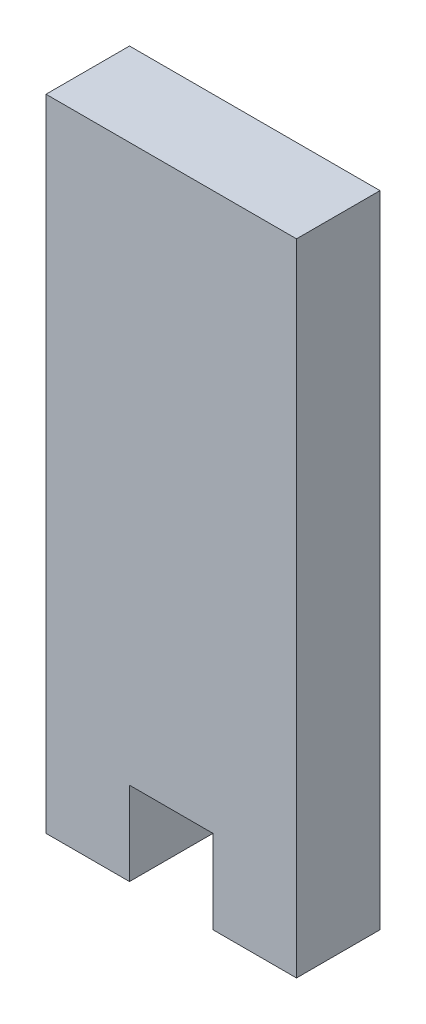
ISO-10303-21;
HEADER;
FILE_DESCRIPTION(('STEP AP214'),'2;1');
FILE_NAME('part.step','',(''),(''),'','','');
FILE_SCHEMA(('AUTOMOTIVE_DESIGN { 1 0 10303 214 1 1 1 1 }'));
ENDSEC;
DATA;
#1=APPLICATION_CONTEXT('core data for automotive mechanical design processes');
#2=APPLICATION_PROTOCOL_DEFINITION('international standard','automotive_design',2000,#1);
#3=PRODUCT_CONTEXT('',#1,'mechanical');
#4=PRODUCT('Part','Part','',(#3));
#5=PRODUCT_RELATED_PRODUCT_CATEGORY('part','',(#4));
#6=PRODUCT_DEFINITION_FORMATION('','',#4);
#7=PRODUCT_DEFINITION_CONTEXT('part definition',#1,'design');
#8=PRODUCT_DEFINITION('design','',#6,#7);
#9=PRODUCT_DEFINITION_SHAPE('','',#8);
#10=(LENGTH_UNIT() NAMED_UNIT(*) SI_UNIT(.MILLI.,.METRE.));
#11=(NAMED_UNIT(*) PLANE_ANGLE_UNIT() SI_UNIT($,.RADIAN.));
#12=(NAMED_UNIT(*) SI_UNIT($,.STERADIAN.) SOLID_ANGLE_UNIT());
#13=UNCERTAINTY_MEASURE_WITH_UNIT(LENGTH_MEASURE(1.E-05),#10,'distance_accuracy_value','');
#14=(GEOMETRIC_REPRESENTATION_CONTEXT(3) GLOBAL_UNCERTAINTY_ASSIGNED_CONTEXT((#13)) GLOBAL_UNIT_ASSIGNED_CONTEXT((#10,
#11,#12)) REPRESENTATION_CONTEXT('',''));
#15=CARTESIAN_POINT('',(0.,0.,0.));
#16=DIRECTION('',(0.,0.,1.));
#17=DIRECTION('',(1.,0.,0.));
#18=AXIS2_PLACEMENT_3D('',#15,#16,#17);
#19=CARTESIAN_POINT('',(-4.40469847019209,17.4625119218916,3.));
#20=DIRECTION('',(1.,0.,0.));
#21=DIRECTION('',(0.,1.,0.));
#22=AXIS2_PLACEMENT_3D('',#19,#20,#21);
#23=PLANE('',#22);
#24=DIRECTION('',(0.,-1.,0.));
#25=VECTOR('',#24,1.);
#26=CARTESIAN_POINT('',(-4.40469847019209,17.4625119218916,0.));
#27=LINE('',#26,#25);
#28=CARTESIAN_POINT('',(-4.40469847019209,17.4625119218916,0.));
#29=VERTEX_POINT('',#28);
#30=CARTESIAN_POINT('',(-4.40469847019209,-5.53748807810843,0.));
#31=VERTEX_POINT('',#30);
#32=EDGE_CURVE('E146',#29,#31,#27,.T.);
#33=ORIENTED_EDGE('',*,*,#32,.T.);
#34=DIRECTION('',(0.,0.,-1.));
#35=VECTOR('',#34,1.);
#36=CARTESIAN_POINT('',(-4.40469847019209,-5.53748807810843,3.));
#37=LINE('',#36,#35);
#38=CARTESIAN_POINT('',(-4.40469847019209,-5.53748807810843,3.));
#39=VERTEX_POINT('',#38);
#40=EDGE_CURVE('E11',#39,#31,#37,.T.);
#41=ORIENTED_EDGE('',*,*,#40,.F.);
#42=DIRECTION('',(0.,-1.,0.));
#43=VECTOR('',#42,1.);
#44=CARTESIAN_POINT('',(-4.40469847019209,17.4625119218916,3.));
#45=LINE('',#44,#43);
#46=CARTESIAN_POINT('',(-4.40469847019209,17.4625119218916,3.));
#47=VERTEX_POINT('',#46);
#48=EDGE_CURVE('E168',#47,#39,#45,.T.);
#49=ORIENTED_EDGE('',*,*,#48,.F.);
#50=DIRECTION('',(0.,0.,-1.));
#51=VECTOR('',#50,1.);
#52=CARTESIAN_POINT('',(-4.40469847019209,17.4625119218916,3.));
#53=LINE('',#52,#51);
#54=EDGE_CURVE('E142',#47,#29,#53,.T.);
#55=ORIENTED_EDGE('',*,*,#54,.T.);
#56=EDGE_LOOP('',(#33,#41,#49,#55));
#57=FACE_BOUND('',#56,.T.);
#58=ADVANCED_FACE('F43',(#57),#23,.F.);
#59=CARTESIAN_POINT('',(-4.40469847019209,-5.53748807810843,3.));
#60=DIRECTION('',(0.,1.,0.));
#61=DIRECTION('',(0.,0.,1.));
#62=AXIS2_PLACEMENT_3D('',#59,#60,#61);
#63=PLANE('',#62);
#64=DIRECTION('',(1.,0.,0.));
#65=VECTOR('',#64,1.);
#66=CARTESIAN_POINT('',(-4.40469847019209,-5.53748807810843,0.));
#67=LINE('',#66,#65);
#68=CARTESIAN_POINT('',(-1.40469847019208,-5.53748807810843,0.));
#69=VERTEX_POINT('',#68);
#70=EDGE_CURVE('E150',#31,#69,#67,.T.);
#71=ORIENTED_EDGE('',*,*,#70,.T.);
#72=DIRECTION('',(0.,0.,-1.));
#73=VECTOR('',#72,1.);
#74=CARTESIAN_POINT('',(-1.40469847019208,-5.53748807810843,3.));
#75=LINE('',#74,#73);
#76=CARTESIAN_POINT('',(-1.40469847019208,-5.53748807810843,3.));
#77=VERTEX_POINT('',#76);
#78=EDGE_CURVE('E52',#77,#69,#75,.T.);
#79=ORIENTED_EDGE('',*,*,#78,.F.);
#80=DIRECTION('',(1.,0.,0.));
#81=VECTOR('',#80,1.);
#82=CARTESIAN_POINT('',(-4.40469847019209,-5.53748807810843,3.));
#83=LINE('',#82,#81);
#84=EDGE_CURVE('E103',#39,#77,#83,.T.);
#85=ORIENTED_EDGE('',*,*,#84,.F.);
#86=ORIENTED_EDGE('',*,*,#40,.T.);
#87=EDGE_LOOP('',(#71,#79,#85,#86));
#88=FACE_BOUND('',#87,.T.);
#89=ADVANCED_FACE('F220',(#88),#63,.F.);
#90=CARTESIAN_POINT('',(-1.40469847019208,-2.53748807810843,3.));
#91=DIRECTION('',(-1.,0.,0.));
#92=DIRECTION('',(0.,-1.,0.));
#93=AXIS2_PLACEMENT_3D('',#90,#91,#92);
#94=PLANE('',#93);
#95=DIRECTION('',(0.,1.,0.));
#96=VECTOR('',#95,1.);
#97=CARTESIAN_POINT('',(-1.40469847019208,-2.53748807810843,0.));
#98=LINE('',#97,#96);
#99=CARTESIAN_POINT('',(-1.40469847019208,-2.53748807810843,0.));
#100=VERTEX_POINT('',#99);
#101=EDGE_CURVE('E153',#69,#100,#98,.T.);
#102=ORIENTED_EDGE('',*,*,#101,.T.);
#103=DIRECTION('',(0.,0.,-1.));
#104=VECTOR('',#103,1.);
#105=CARTESIAN_POINT('',(-1.40469847019208,-2.53748807810843,3.));
#106=LINE('',#105,#104);
#107=CARTESIAN_POINT('',(-1.40469847019208,-2.53748807810843,3.));
#108=VERTEX_POINT('',#107);
#109=EDGE_CURVE('E179',#108,#100,#106,.T.);
#110=ORIENTED_EDGE('',*,*,#109,.F.);
#111=DIRECTION('',(0.,1.,0.));
#112=VECTOR('',#111,1.);
#113=CARTESIAN_POINT('',(-1.40469847019208,-2.53748807810843,3.));
#114=LINE('',#113,#112);
#115=EDGE_CURVE('E191',#77,#108,#114,.T.);
#116=ORIENTED_EDGE('',*,*,#115,.F.);
#117=ORIENTED_EDGE('',*,*,#78,.T.);
#118=EDGE_LOOP('',(#102,#110,#116,#117));
#119=FACE_BOUND('',#118,.T.);
#120=ADVANCED_FACE('F189',(#119),#94,.F.);
#121=CARTESIAN_POINT('',(-1.40469847019208,-2.53748807810843,3.));
#122=DIRECTION('',(0.,1.,0.));
#123=DIRECTION('',(-1.,0.,0.));
#124=AXIS2_PLACEMENT_3D('',#121,#122,#123);
#125=PLANE('',#124);
#126=DIRECTION('',(1.,0.,0.));
#127=VECTOR('',#126,1.);
#128=CARTESIAN_POINT('',(-1.40469847019208,-2.53748807810843,0.));
#129=LINE('',#128,#127);
#130=CARTESIAN_POINT('',(1.59530152980792,-2.53748807810843,0.));
#131=VERTEX_POINT('',#130);
#132=EDGE_CURVE('E156',#100,#131,#129,.T.);
#133=ORIENTED_EDGE('',*,*,#132,.T.);
#134=DIRECTION('',(0.,0.,-1.));
#135=VECTOR('',#134,1.);
#136=CARTESIAN_POINT('',(1.59530152980792,-2.53748807810843,3.));
#137=LINE('',#136,#135);
#138=CARTESIAN_POINT('',(1.59530152980792,-2.53748807810843,3.));
#139=VERTEX_POINT('',#138);
#140=EDGE_CURVE('E175',#139,#131,#137,.T.);
#141=ORIENTED_EDGE('',*,*,#140,.F.);
#142=DIRECTION('',(1.,0.,0.));
#143=VECTOR('',#142,1.);
#144=CARTESIAN_POINT('',(-1.40469847019208,-2.53748807810843,3.));
#145=LINE('',#144,#143);
#146=EDGE_CURVE('E204',#108,#139,#145,.T.);
#147=ORIENTED_EDGE('',*,*,#146,.F.);
#148=ORIENTED_EDGE('',*,*,#109,.T.);
#149=EDGE_LOOP('',(#133,#141,#147,#148));
#150=FACE_BOUND('',#149,.T.);
#151=ADVANCED_FACE('F199',(#150),#125,.F.);
#152=CARTESIAN_POINT('',(1.59530152980792,-2.53748807810843,3.));
#153=DIRECTION('',(1.,0.,0.));
#154=DIRECTION('',(0.,1.,0.));
#155=AXIS2_PLACEMENT_3D('',#152,#153,#154);
#156=PLANE('',#155);
#157=DIRECTION('',(0.,-1.,0.));
#158=VECTOR('',#157,1.);
#159=CARTESIAN_POINT('',(1.59530152980792,-2.53748807810843,0.));
#160=LINE('',#159,#158);
#161=CARTESIAN_POINT('',(1.59530152980792,-5.53748807810843,0.));
#162=VERTEX_POINT('',#161);
#163=EDGE_CURVE('E159',#131,#162,#160,.T.);
#164=ORIENTED_EDGE('',*,*,#163,.T.);
#165=DIRECTION('',(0.,0.,-1.));
#166=VECTOR('',#165,1.);
#167=CARTESIAN_POINT('',(1.59530152980792,-5.53748807810843,3.));
#168=LINE('',#167,#166);
#169=CARTESIAN_POINT('',(1.59530152980792,-5.53748807810843,3.));
#170=VERTEX_POINT('',#169);
#171=EDGE_CURVE('E133',#170,#162,#168,.T.);
#172=ORIENTED_EDGE('',*,*,#171,.F.);
#173=DIRECTION('',(0.,-1.,0.));
#174=VECTOR('',#173,1.);
#175=CARTESIAN_POINT('',(1.59530152980792,-2.53748807810843,3.));
#176=LINE('',#175,#174);
#177=EDGE_CURVE('E122',#139,#170,#176,.T.);
#178=ORIENTED_EDGE('',*,*,#177,.F.);
#179=ORIENTED_EDGE('',*,*,#140,.T.);
#180=EDGE_LOOP('',(#164,#172,#178,#179));
#181=FACE_BOUND('',#180,.T.);
#182=ADVANCED_FACE('F202',(#181),#156,.F.);
#183=CARTESIAN_POINT('',(1.59530152980792,-5.53748807810843,3.));
#184=DIRECTION('',(0.,1.,0.));
#185=DIRECTION('',(0.,0.,1.));
#186=AXIS2_PLACEMENT_3D('',#183,#184,#185);
#187=PLANE('',#186);
#188=DIRECTION('',(1.,0.,0.));
#189=VECTOR('',#188,1.);
#190=CARTESIAN_POINT('',(1.59530152980792,-5.53748807810843,0.));
#191=LINE('',#190,#189);
#192=CARTESIAN_POINT('',(4.59530152980792,-5.53748807810843,0.));
#193=VERTEX_POINT('',#192);
#194=EDGE_CURVE('E131',#162,#193,#191,.T.);
#195=ORIENTED_EDGE('',*,*,#194,.T.);
#196=DIRECTION('',(0.,0.,-1.));
#197=VECTOR('',#196,1.);
#198=CARTESIAN_POINT('',(4.59530152980792,-5.53748807810843,3.));
#199=LINE('',#198,#197);
#200=CARTESIAN_POINT('',(4.59530152980792,-5.53748807810843,3.));
#201=VERTEX_POINT('',#200);
#202=EDGE_CURVE('E128',#201,#193,#199,.T.);
#203=ORIENTED_EDGE('',*,*,#202,.F.);
#204=DIRECTION('',(1.,0.,0.));
#205=VECTOR('',#204,1.);
#206=CARTESIAN_POINT('',(1.59530152980792,-5.53748807810843,3.));
#207=LINE('',#206,#205);
#208=EDGE_CURVE('E116',#170,#201,#207,.T.);
#209=ORIENTED_EDGE('',*,*,#208,.F.);
#210=ORIENTED_EDGE('',*,*,#171,.T.);
#211=EDGE_LOOP('',(#195,#203,#209,#210));
#212=FACE_BOUND('',#211,.T.);
#213=ADVANCED_FACE('F129',(#212),#187,.F.);
#214=CARTESIAN_POINT('',(4.59530152980792,17.4625119218916,3.));
#215=DIRECTION('',(-1.,0.,0.));
#216=DIRECTION('',(0.,-1.,0.));
#217=AXIS2_PLACEMENT_3D('',#214,#215,#216);
#218=PLANE('',#217);
#219=DIRECTION('',(0.,1.,0.));
#220=VECTOR('',#219,1.);
#221=CARTESIAN_POINT('',(4.59530152980792,17.4625119218916,0.));
#222=LINE('',#221,#220);
#223=CARTESIAN_POINT('',(4.59530152980792,17.4625119218916,0.));
#224=VERTEX_POINT('',#223);
#225=EDGE_CURVE('E89',#193,#224,#222,.T.);
#226=ORIENTED_EDGE('',*,*,#225,.T.);
#227=DIRECTION('',(0.,0.,-1.));
#228=VECTOR('',#227,1.);
#229=CARTESIAN_POINT('',(4.59530152980792,17.4625119218916,3.));
#230=LINE('',#229,#228);
#231=CARTESIAN_POINT('',(4.59530152980792,17.4625119218916,3.));
#232=VERTEX_POINT('',#231);
#233=EDGE_CURVE('E134',#232,#224,#230,.T.);
#234=ORIENTED_EDGE('',*,*,#233,.F.);
#235=DIRECTION('',(0.,1.,0.));
#236=VECTOR('',#235,1.);
#237=CARTESIAN_POINT('',(4.59530152980792,17.4625119218916,3.));
#238=LINE('',#237,#236);
#239=EDGE_CURVE('E120',#201,#232,#238,.T.);
#240=ORIENTED_EDGE('',*,*,#239,.F.);
#241=ORIENTED_EDGE('',*,*,#202,.T.);
#242=EDGE_LOOP('',(#226,#234,#240,#241));
#243=FACE_BOUND('',#242,.T.);
#244=ADVANCED_FACE('F136',(#243),#218,.F.);
#245=CARTESIAN_POINT('',(-4.40469847019209,17.4625119218916,3.));
#246=DIRECTION('',(0.,-1.,0.));
#247=DIRECTION('',(0.,0.,-1.));
#248=AXIS2_PLACEMENT_3D('',#245,#246,#247);
#249=PLANE('',#248);
#250=DIRECTION('',(-1.,0.,0.));
#251=VECTOR('',#250,1.);
#252=CARTESIAN_POINT('',(-4.40469847019209,17.4625119218916,0.));
#253=LINE('',#252,#251);
#254=EDGE_CURVE('E95',#224,#29,#253,.T.);
#255=ORIENTED_EDGE('',*,*,#254,.T.);
#256=ORIENTED_EDGE('',*,*,#54,.F.);
#257=DIRECTION('',(-1.,0.,0.));
#258=VECTOR('',#257,1.);
#259=CARTESIAN_POINT('',(-4.40469847019209,17.4625119218916,3.));
#260=LINE('',#259,#258);
#261=EDGE_CURVE('E60',#232,#47,#260,.T.);
#262=ORIENTED_EDGE('',*,*,#261,.F.);
#263=ORIENTED_EDGE('',*,*,#233,.T.);
#264=EDGE_LOOP('',(#255,#256,#262,#263));
#265=FACE_BOUND('',#264,.T.);
#266=ADVANCED_FACE('F236',(#265),#249,.F.);
#267=CARTESIAN_POINT('',(0.,0.,3.));
#268=DIRECTION('',(0.,0.,1.));
#269=DIRECTION('',(1.,0.,0.));
#270=AXIS2_PLACEMENT_3D('',#267,#268,#269);
#271=PLANE('',#270);
#272=ORIENTED_EDGE('',*,*,#48,.T.);
#273=ORIENTED_EDGE('',*,*,#84,.T.);
#274=ORIENTED_EDGE('',*,*,#115,.T.);
#275=ORIENTED_EDGE('',*,*,#146,.T.);
#276=ORIENTED_EDGE('',*,*,#177,.T.);
#277=ORIENTED_EDGE('',*,*,#208,.T.);
#278=ORIENTED_EDGE('',*,*,#239,.T.);
#279=ORIENTED_EDGE('',*,*,#261,.T.);
#280=EDGE_LOOP('',(#272,#273,#274,#275,#276,#277,#278,#279));
#281=FACE_BOUND('',#280,.T.);
#282=ADVANCED_FACE('F118',(#281),#271,.T.);
#283=CARTESIAN_POINT('',(0.,0.,0.));
#284=DIRECTION('',(0.,0.,1.));
#285=DIRECTION('',(1.,0.,0.));
#286=AXIS2_PLACEMENT_3D('',#283,#284,#285);
#287=PLANE('',#286);
#288=ORIENTED_EDGE('',*,*,#32,.F.);
#289=ORIENTED_EDGE('',*,*,#254,.F.);
#290=ORIENTED_EDGE('',*,*,#225,.F.);
#291=ORIENTED_EDGE('',*,*,#194,.F.);
#292=ORIENTED_EDGE('',*,*,#163,.F.);
#293=ORIENTED_EDGE('',*,*,#132,.F.);
#294=ORIENTED_EDGE('',*,*,#101,.F.);
#295=ORIENTED_EDGE('',*,*,#70,.F.);
#296=EDGE_LOOP('',(#288,#289,#290,#291,#292,#293,#294,#295));
#297=FACE_BOUND('',#296,.T.);
#298=ADVANCED_FACE('F195',(#297),#287,.F.);
#299=CLOSED_SHELL('',(#58,#89,#120,#151,#182,#213,#244,#266,#282,#298));
#300=MANIFOLD_SOLID_BREP('B2',#299);
#301=ADVANCED_BREP_SHAPE_REPRESENTATION('',(#18,#300),#14);
#302=SHAPE_DEFINITION_REPRESENTATION(#9,#301);
ENDSEC;
END-ISO-10303-21;
